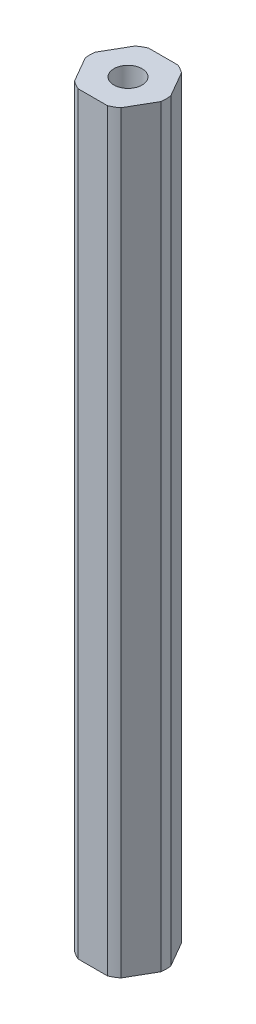
ISO-10303-21;
HEADER;
FILE_DESCRIPTION(('STEP AP214'),'2;1');
FILE_NAME('part.step','',(''),(''),'','','');
FILE_SCHEMA(('AUTOMOTIVE_DESIGN { 1 0 10303 214 1 1 1 1 }'));
ENDSEC;
DATA;
#1=APPLICATION_CONTEXT('core data for automotive mechanical design processes');
#2=APPLICATION_PROTOCOL_DEFINITION('international standard','automotive_design',2000,#1);
#3=PRODUCT_CONTEXT('',#1,'mechanical');
#4=PRODUCT('Part','Part','',(#3));
#5=PRODUCT_RELATED_PRODUCT_CATEGORY('part','',(#4));
#6=PRODUCT_DEFINITION_FORMATION('','',#4);
#7=PRODUCT_DEFINITION_CONTEXT('part definition',#1,'design');
#8=PRODUCT_DEFINITION('design','',#6,#7);
#9=PRODUCT_DEFINITION_SHAPE('','',#8);
#10=(LENGTH_UNIT() NAMED_UNIT(*) SI_UNIT(.MILLI.,.METRE.));
#11=(NAMED_UNIT(*) PLANE_ANGLE_UNIT() SI_UNIT($,.RADIAN.));
#12=(NAMED_UNIT(*) SI_UNIT($,.STERADIAN.) SOLID_ANGLE_UNIT());
#13=UNCERTAINTY_MEASURE_WITH_UNIT(LENGTH_MEASURE(1.E-05),#10,'distance_accuracy_value','');
#14=(GEOMETRIC_REPRESENTATION_CONTEXT(3) GLOBAL_UNCERTAINTY_ASSIGNED_CONTEXT((#13)) GLOBAL_UNIT_ASSIGNED_CONTEXT((#10,
#11,#12)) REPRESENTATION_CONTEXT('',''));
#15=CARTESIAN_POINT('',(0.,0.,0.));
#16=DIRECTION('',(0.,0.,1.));
#17=DIRECTION('',(1.,0.,0.));
#18=AXIS2_PLACEMENT_3D('',#15,#16,#17);
#19=CARTESIAN_POINT('',(0.,67.945,6.35));
#20=DIRECTION('',(0.,0.,-1.));
#21=DIRECTION('',(-1.,0.,0.));
#22=AXIS2_PLACEMENT_3D('',#19,#20,#21);
#23=PLANE('',#22);
#24=DIRECTION('',(1.,0.,0.));
#25=VECTOR('',#24,1.);
#26=CARTESIAN_POINT('',(0.,-67.945,6.35));
#27=LINE('',#26,#25);
#28=CARTESIAN_POINT('',(-2.63701547367474,-67.945,6.35));
#29=VERTEX_POINT('',#28);
#30=CARTESIAN_POINT('',(2.63701547367474,-67.945,6.35));
#31=VERTEX_POINT('',#30);
#32=EDGE_CURVE('E161',#29,#31,#27,.T.);
#33=ORIENTED_EDGE('',*,*,#32,.T.);
#34=DIRECTION('',(0.,-1.,0.));
#35=VECTOR('',#34,1.);
#36=CARTESIAN_POINT('',(2.63701547367474,67.945,6.35));
#37=LINE('',#36,#35);
#38=CARTESIAN_POINT('',(2.63701547367474,67.945,6.35));
#39=VERTEX_POINT('',#38);
#40=EDGE_CURVE('E11',#39,#31,#37,.T.);
#41=ORIENTED_EDGE('',*,*,#40,.F.);
#42=DIRECTION('',(1.,0.,0.));
#43=VECTOR('',#42,1.);
#44=CARTESIAN_POINT('',(0.,67.945,6.35));
#45=LINE('',#44,#43);
#46=CARTESIAN_POINT('',(-2.63701547367474,67.945,6.35));
#47=VERTEX_POINT('',#46);
#48=EDGE_CURVE('E220',#47,#39,#45,.T.);
#49=ORIENTED_EDGE('',*,*,#48,.F.);
#50=DIRECTION('',(0.,-1.,0.));
#51=VECTOR('',#50,1.);
#52=CARTESIAN_POINT('',(-2.63701547367474,67.945,6.35));
#53=LINE('',#52,#51);
#54=EDGE_CURVE('E154',#47,#29,#53,.T.);
#55=ORIENTED_EDGE('',*,*,#54,.T.);
#56=EDGE_LOOP('',(#33,#41,#49,#55));
#57=FACE_BOUND('',#56,.T.);
#58=ADVANCED_FACE('F36',(#57),#23,.F.);
#59=CARTESIAN_POINT('',(0.,67.945,0.));
#60=DIRECTION('',(0.,-1.,0.));
#61=DIRECTION('',(0.,0.,-1.));
#62=AXIS2_PLACEMENT_3D('',#59,#60,#61);
#63=CYLINDRICAL_SURFACE('',#62,6.87578);
#64=CARTESIAN_POINT('',(0.,-67.945,0.));
#65=DIRECTION('',(0.,1.,0.));
#66=DIRECTION('',(0.,0.,1.));
#67=AXIS2_PLACEMENT_3D('',#64,#65,#66);
#68=CIRCLE('',#67,6.87578);
#69=CARTESIAN_POINT('',(4.18075357719382,-67.945,5.45872239037497));
#70=VERTEX_POINT('',#69);
#71=EDGE_CURVE('E164',#31,#70,#68,.T.);
#72=ORIENTED_EDGE('',*,*,#71,.T.);
#73=DIRECTION('',(0.,-1.,0.));
#74=VECTOR('',#73,1.);
#75=CARTESIAN_POINT('',(4.18075357719382,67.945,5.45872239037497));
#76=LINE('',#75,#74);
#77=CARTESIAN_POINT('',(4.18075357719382,67.945,5.45872239037497));
#78=VERTEX_POINT('',#77);
#79=EDGE_CURVE('E45',#78,#70,#76,.T.);
#80=ORIENTED_EDGE('',*,*,#79,.F.);
#81=CARTESIAN_POINT('',(0.,67.945,0.));
#82=DIRECTION('',(0.,1.,0.));
#83=DIRECTION('',(0.,0.,1.));
#84=AXIS2_PLACEMENT_3D('',#81,#82,#83);
#85=CIRCLE('',#84,6.87578);
#86=EDGE_CURVE('E108',#39,#78,#85,.T.);
#87=ORIENTED_EDGE('',*,*,#86,.F.);
#88=ORIENTED_EDGE('',*,*,#40,.T.);
#89=EDGE_LOOP('',(#72,#80,#87,#88));
#90=FACE_BOUND('',#89,.T.);
#91=ADVANCED_FACE('F255',(#90),#63,.T.);
#92=CARTESIAN_POINT('',(5.49926131403119,67.945,3.175));
#93=DIRECTION('',(-0.866025403784439,0.,-0.5));
#94=DIRECTION('',(-0.5,0.,0.866025403784439));
#95=AXIS2_PLACEMENT_3D('',#92,#93,#94);
#96=PLANE('',#95);
#97=DIRECTION('',(0.5,0.,-0.866025403784439));
#98=VECTOR('',#97,1.);
#99=CARTESIAN_POINT('',(5.49926131403119,-67.945,3.175));
#100=LINE('',#99,#98);
#101=CARTESIAN_POINT('',(6.81776905086855,-67.945,0.891277609625022));
#102=VERTEX_POINT('',#101);
#103=EDGE_CURVE('E166',#70,#102,#100,.T.);
#104=ORIENTED_EDGE('',*,*,#103,.T.);
#105=DIRECTION('',(0.,-1.,0.));
#106=VECTOR('',#105,1.);
#107=CARTESIAN_POINT('',(6.81776905086855,67.945,0.891277609625022));
#108=LINE('',#107,#106);
#109=CARTESIAN_POINT('',(6.81776905086855,67.945,0.891277609625022));
#110=VERTEX_POINT('',#109);
#111=EDGE_CURVE('E196',#110,#102,#108,.T.);
#112=ORIENTED_EDGE('',*,*,#111,.F.);
#113=DIRECTION('',(0.5,0.,-0.866025403784439));
#114=VECTOR('',#113,1.);
#115=CARTESIAN_POINT('',(5.49926131403119,67.945,3.175));
#116=LINE('',#115,#114);
#117=EDGE_CURVE('E204',#78,#110,#116,.T.);
#118=ORIENTED_EDGE('',*,*,#117,.F.);
#119=ORIENTED_EDGE('',*,*,#79,.T.);
#120=EDGE_LOOP('',(#104,#112,#118,#119));
#121=FACE_BOUND('',#120,.T.);
#122=ADVANCED_FACE('F202',(#121),#96,.F.);
#123=CARTESIAN_POINT('',(6.81776905086856,-67.945,-0.891277609625022));
#124=VERTEX_POINT('',#123);
#125=EDGE_CURVE('E167',#102,#124,#68,.T.);
#126=ORIENTED_EDGE('',*,*,#125,.T.);
#127=DIRECTION('',(0.,-1.,0.));
#128=VECTOR('',#127,1.);
#129=CARTESIAN_POINT('',(6.81776905086856,67.945,-0.891277609625022));
#130=LINE('',#129,#128);
#131=CARTESIAN_POINT('',(6.81776905086856,67.945,-0.891277609625022));
#132=VERTEX_POINT('',#131);
#133=EDGE_CURVE('E193',#132,#124,#130,.T.);
#134=ORIENTED_EDGE('',*,*,#133,.F.);
#135=EDGE_CURVE('E226',#110,#132,#85,.T.);
#136=ORIENTED_EDGE('',*,*,#135,.F.);
#137=ORIENTED_EDGE('',*,*,#111,.T.);
#138=EDGE_LOOP('',(#126,#134,#136,#137));
#139=FACE_BOUND('',#138,.T.);
#140=ADVANCED_FACE('F237',(#139),#63,.T.);
#141=CARTESIAN_POINT('',(5.49926131403118,67.945,-3.175));
#142=DIRECTION('',(-0.866025403784438,0.,0.5));
#143=DIRECTION('',(0.5,0.,0.866025403784439));
#144=AXIS2_PLACEMENT_3D('',#141,#142,#143);
#145=PLANE('',#144);
#146=DIRECTION('',(-0.5,0.,-0.866025403784439));
#147=VECTOR('',#146,1.);
#148=CARTESIAN_POINT('',(5.49926131403118,-67.945,-3.175));
#149=LINE('',#148,#147);
#150=CARTESIAN_POINT('',(4.18075357719381,-67.945,-5.45872239037498));
#151=VERTEX_POINT('',#150);
#152=EDGE_CURVE('E169',#124,#151,#149,.T.);
#153=ORIENTED_EDGE('',*,*,#152,.T.);
#154=DIRECTION('',(0.,-1.,0.));
#155=VECTOR('',#154,1.);
#156=CARTESIAN_POINT('',(4.18075357719381,67.945,-5.45872239037498));
#157=LINE('',#156,#155);
#158=CARTESIAN_POINT('',(4.18075357719381,67.945,-5.45872239037498));
#159=VERTEX_POINT('',#158);
#160=EDGE_CURVE('E190',#159,#151,#157,.T.);
#161=ORIENTED_EDGE('',*,*,#160,.F.);
#162=DIRECTION('',(-0.5,0.,-0.866025403784439));
#163=VECTOR('',#162,1.);
#164=CARTESIAN_POINT('',(5.49926131403118,67.945,-3.175));
#165=LINE('',#164,#163);
#166=EDGE_CURVE('E228',#132,#159,#165,.T.);
#167=ORIENTED_EDGE('',*,*,#166,.F.);
#168=ORIENTED_EDGE('',*,*,#133,.T.);
#169=EDGE_LOOP('',(#153,#161,#167,#168));
#170=FACE_BOUND('',#169,.T.);
#171=ADVANCED_FACE('F239',(#170),#145,.F.);
#172=CARTESIAN_POINT('',(2.63701547367473,-67.945,-6.35));
#173=VERTEX_POINT('',#172);
#174=EDGE_CURVE('E171',#151,#173,#68,.T.);
#175=ORIENTED_EDGE('',*,*,#174,.T.);
#176=DIRECTION('',(0.,-1.,0.));
#177=VECTOR('',#176,1.);
#178=CARTESIAN_POINT('',(2.63701547367473,67.945,-6.35));
#179=LINE('',#178,#177);
#180=CARTESIAN_POINT('',(2.63701547367473,67.945,-6.35));
#181=VERTEX_POINT('',#180);
#182=EDGE_CURVE('E187',#181,#173,#179,.T.);
#183=ORIENTED_EDGE('',*,*,#182,.F.);
#184=EDGE_CURVE('E229',#159,#181,#85,.T.);
#185=ORIENTED_EDGE('',*,*,#184,.F.);
#186=ORIENTED_EDGE('',*,*,#160,.T.);
#187=EDGE_LOOP('',(#175,#183,#185,#186));
#188=FACE_BOUND('',#187,.T.);
#189=ADVANCED_FACE('F240',(#188),#63,.T.);
#190=CARTESIAN_POINT('',(0.,67.945,-6.35));
#191=DIRECTION('',(0.,0.,1.));
#192=DIRECTION('',(1.,0.,0.));
#193=AXIS2_PLACEMENT_3D('',#190,#191,#192);
#194=PLANE('',#193);
#195=DIRECTION('',(-1.,0.,0.));
#196=VECTOR('',#195,1.);
#197=CARTESIAN_POINT('',(0.,-67.945,-6.35));
#198=LINE('',#197,#196);
#199=CARTESIAN_POINT('',(-2.63701547367473,-67.945,-6.35));
#200=VERTEX_POINT('',#199);
#201=EDGE_CURVE('E172',#173,#200,#198,.T.);
#202=ORIENTED_EDGE('',*,*,#201,.T.);
#203=DIRECTION('',(0.,-1.,0.));
#204=VECTOR('',#203,1.);
#205=CARTESIAN_POINT('',(-2.63701547367473,67.945,-6.35));
#206=LINE('',#205,#204);
#207=CARTESIAN_POINT('',(-2.63701547367473,67.945,-6.35));
#208=VERTEX_POINT('',#207);
#209=EDGE_CURVE('E184',#208,#200,#206,.T.);
#210=ORIENTED_EDGE('',*,*,#209,.F.);
#211=DIRECTION('',(-1.,0.,0.));
#212=VECTOR('',#211,1.);
#213=CARTESIAN_POINT('',(0.,67.945,-6.35));
#214=LINE('',#213,#212);
#215=EDGE_CURVE('E230',#181,#208,#214,.T.);
#216=ORIENTED_EDGE('',*,*,#215,.F.);
#217=ORIENTED_EDGE('',*,*,#182,.T.);
#218=EDGE_LOOP('',(#202,#210,#216,#217));
#219=FACE_BOUND('',#218,.T.);
#220=ADVANCED_FACE('F243',(#219),#194,.F.);
#221=CARTESIAN_POINT('',(-4.18075357719382,-67.945,-5.45872239037497));
#222=VERTEX_POINT('',#221);
#223=EDGE_CURVE('E174',#200,#222,#68,.T.);
#224=ORIENTED_EDGE('',*,*,#223,.T.);
#225=DIRECTION('',(0.,-1.,0.));
#226=VECTOR('',#225,1.);
#227=CARTESIAN_POINT('',(-4.18075357719382,67.945,-5.45872239037497));
#228=LINE('',#227,#226);
#229=CARTESIAN_POINT('',(-4.18075357719382,67.945,-5.45872239037497));
#230=VERTEX_POINT('',#229);
#231=EDGE_CURVE('E181',#230,#222,#228,.T.);
#232=ORIENTED_EDGE('',*,*,#231,.F.);
#233=EDGE_CURVE('E144',#208,#230,#85,.T.);
#234=ORIENTED_EDGE('',*,*,#233,.F.);
#235=ORIENTED_EDGE('',*,*,#209,.T.);
#236=EDGE_LOOP('',(#224,#232,#234,#235));
#237=FACE_BOUND('',#236,.T.);
#238=ADVANCED_FACE('F245',(#237),#63,.T.);
#239=CARTESIAN_POINT('',(-5.49926131403119,67.945,-3.175));
#240=DIRECTION('',(0.866025403784438,0.,0.5));
#241=DIRECTION('',(0.5,0.,-0.866025403784439));
#242=AXIS2_PLACEMENT_3D('',#239,#240,#241);
#243=PLANE('',#242);
#244=DIRECTION('',(-0.5,0.,0.866025403784439));
#245=VECTOR('',#244,1.);
#246=CARTESIAN_POINT('',(-5.49926131403119,-67.945,-3.175));
#247=LINE('',#246,#245);
#248=CARTESIAN_POINT('',(-6.81776905086855,-67.945,-0.891277609625031));
#249=VERTEX_POINT('',#248);
#250=EDGE_CURVE('E175',#222,#249,#247,.T.);
#251=ORIENTED_EDGE('',*,*,#250,.T.);
#252=DIRECTION('',(0.,-1.,0.));
#253=VECTOR('',#252,1.);
#254=CARTESIAN_POINT('',(-6.81776905086855,67.945,-0.891277609625031));
#255=LINE('',#254,#253);
#256=CARTESIAN_POINT('',(-6.81776905086855,67.945,-0.891277609625031));
#257=VERTEX_POINT('',#256);
#258=EDGE_CURVE('E149',#257,#249,#255,.T.);
#259=ORIENTED_EDGE('',*,*,#258,.F.);
#260=DIRECTION('',(-0.5,0.,0.866025403784439));
#261=VECTOR('',#260,1.);
#262=CARTESIAN_POINT('',(-5.49926131403119,67.945,-3.175));
#263=LINE('',#262,#261);
#264=EDGE_CURVE('E139',#230,#257,#263,.T.);
#265=ORIENTED_EDGE('',*,*,#264,.F.);
#266=ORIENTED_EDGE('',*,*,#231,.T.);
#267=EDGE_LOOP('',(#251,#259,#265,#266));
#268=FACE_BOUND('',#267,.T.);
#269=ADVANCED_FACE('F248',(#268),#243,.F.);
#270=CARTESIAN_POINT('',(-6.81776905086855,-67.945,0.891277609625025));
#271=VERTEX_POINT('',#270);
#272=EDGE_CURVE('E148',#249,#271,#68,.T.);
#273=ORIENTED_EDGE('',*,*,#272,.T.);
#274=DIRECTION('',(0.,-1.,0.));
#275=VECTOR('',#274,1.);
#276=CARTESIAN_POINT('',(-6.81776905086855,67.945,0.891277609625025));
#277=LINE('',#276,#275);
#278=CARTESIAN_POINT('',(-6.81776905086855,67.945,0.891277609625025));
#279=VERTEX_POINT('',#278);
#280=EDGE_CURVE('E145',#279,#271,#277,.T.);
#281=ORIENTED_EDGE('',*,*,#280,.F.);
#282=EDGE_CURVE('E133',#257,#279,#85,.T.);
#283=ORIENTED_EDGE('',*,*,#282,.F.);
#284=ORIENTED_EDGE('',*,*,#258,.T.);
#285=EDGE_LOOP('',(#273,#281,#283,#284));
#286=FACE_BOUND('',#285,.T.);
#287=ADVANCED_FACE('F146',(#286),#63,.T.);
#288=CARTESIAN_POINT('',(-5.49926131403118,67.945,3.175));
#289=DIRECTION('',(0.866025403784438,0.,-0.5));
#290=DIRECTION('',(-0.5,0.,-0.866025403784438));
#291=AXIS2_PLACEMENT_3D('',#288,#289,#290);
#292=PLANE('',#291);
#293=DIRECTION('',(0.5,0.,0.866025403784438));
#294=VECTOR('',#293,1.);
#295=CARTESIAN_POINT('',(-5.49926131403118,-67.945,3.175));
#296=LINE('',#295,#294);
#297=CARTESIAN_POINT('',(-4.18075357719381,-67.945,5.45872239037498));
#298=VERTEX_POINT('',#297);
#299=EDGE_CURVE('E94',#271,#298,#296,.T.);
#300=ORIENTED_EDGE('',*,*,#299,.T.);
#301=DIRECTION('',(0.,-1.,0.));
#302=VECTOR('',#301,1.);
#303=CARTESIAN_POINT('',(-4.18075357719381,67.945,5.45872239037498));
#304=LINE('',#303,#302);
#305=CARTESIAN_POINT('',(-4.18075357719381,67.945,5.45872239037498));
#306=VERTEX_POINT('',#305);
#307=EDGE_CURVE('E150',#306,#298,#304,.T.);
#308=ORIENTED_EDGE('',*,*,#307,.F.);
#309=DIRECTION('',(0.5,0.,0.866025403784438));
#310=VECTOR('',#309,1.);
#311=CARTESIAN_POINT('',(-5.49926131403118,67.945,3.175));
#312=LINE('',#311,#310);
#313=EDGE_CURVE('E137',#279,#306,#312,.T.);
#314=ORIENTED_EDGE('',*,*,#313,.F.);
#315=ORIENTED_EDGE('',*,*,#280,.T.);
#316=EDGE_LOOP('',(#300,#308,#314,#315));
#317=FACE_BOUND('',#316,.T.);
#318=ADVANCED_FACE('F152',(#317),#292,.F.);
#319=CARTESIAN_POINT('',(0.,67.945,0.));
#320=DIRECTION('',(0.,-1.,0.));
#321=DIRECTION('',(0.,0.,-1.));
#322=AXIS2_PLACEMENT_3D('',#319,#320,#321);
#323=CYLINDRICAL_SURFACE('',#322,2.5527);
#324=CARTESIAN_POINT('',(0.,67.945,0.));
#325=DIRECTION('',(0.,1.,0.));
#326=DIRECTION('',(0.,0.,1.));
#327=AXIS2_PLACEMENT_3D('',#324,#325,#326);
#328=CIRCLE('',#327,2.5527);
#329=CARTESIAN_POINT('',(0.,67.945,2.5527));
#330=VERTEX_POINT('',#329);
#331=EDGE_CURVE('E218',#330,#330,#328,.T.);
#332=ORIENTED_EDGE('',*,*,#331,.T.);
#333=EDGE_LOOP('',(#332));
#334=FACE_BOUND('',#333,.T.);
#335=CARTESIAN_POINT('',(0.,-67.945,0.));
#336=DIRECTION('',(0.,1.,0.));
#337=DIRECTION('',(0.,0.,1.));
#338=AXIS2_PLACEMENT_3D('',#335,#336,#337);
#339=CIRCLE('',#338,2.5527);
#340=CARTESIAN_POINT('',(0.,-67.945,2.5527));
#341=VERTEX_POINT('',#340);
#342=EDGE_CURVE('E158',#341,#341,#339,.T.);
#343=ORIENTED_EDGE('',*,*,#342,.F.);
#344=EDGE_LOOP('',(#343));
#345=FACE_BOUND('',#344,.T.);
#346=ADVANCED_FACE('F38',(#334,#345),#323,.F.);
#347=EDGE_CURVE('E100',#298,#29,#68,.T.);
#348=ORIENTED_EDGE('',*,*,#347,.T.);
#349=ORIENTED_EDGE('',*,*,#54,.F.);
#350=EDGE_CURVE('E53',#306,#47,#85,.T.);
#351=ORIENTED_EDGE('',*,*,#350,.F.);
#352=ORIENTED_EDGE('',*,*,#307,.T.);
#353=EDGE_LOOP('',(#348,#349,#351,#352));
#354=FACE_BOUND('',#353,.T.);
#355=ADVANCED_FACE('F252',(#354),#63,.T.);
#356=CARTESIAN_POINT('',(0.,67.945,0.));
#357=DIRECTION('',(0.,1.,0.));
#358=DIRECTION('',(0.,0.,1.));
#359=AXIS2_PLACEMENT_3D('',#356,#357,#358);
#360=PLANE('',#359);
#361=ORIENTED_EDGE('',*,*,#331,.F.);
#362=EDGE_LOOP('',(#361));
#363=FACE_BOUND('',#362,.T.);
#364=ORIENTED_EDGE('',*,*,#48,.T.);
#365=ORIENTED_EDGE('',*,*,#86,.T.);
#366=ORIENTED_EDGE('',*,*,#117,.T.);
#367=ORIENTED_EDGE('',*,*,#135,.T.);
#368=ORIENTED_EDGE('',*,*,#166,.T.);
#369=ORIENTED_EDGE('',*,*,#184,.T.);
#370=ORIENTED_EDGE('',*,*,#215,.T.);
#371=ORIENTED_EDGE('',*,*,#233,.T.);
#372=ORIENTED_EDGE('',*,*,#264,.T.);
#373=ORIENTED_EDGE('',*,*,#282,.T.);
#374=ORIENTED_EDGE('',*,*,#313,.T.);
#375=ORIENTED_EDGE('',*,*,#350,.T.);
#376=EDGE_LOOP('',(#364,#365,#366,#367,#368,#369,#370,#371,#372,#373,#374,#375));
#377=FACE_BOUND('',#376,.T.);
#378=ADVANCED_FACE('F135',(#363,#377),#360,.T.);
#379=CARTESIAN_POINT('',(0.,-67.945,0.));
#380=DIRECTION('',(0.,1.,0.));
#381=DIRECTION('',(0.,0.,1.));
#382=AXIS2_PLACEMENT_3D('',#379,#380,#381);
#383=PLANE('',#382);
#384=ORIENTED_EDGE('',*,*,#342,.T.);
#385=EDGE_LOOP('',(#384));
#386=FACE_BOUND('',#385,.T.);
#387=ORIENTED_EDGE('',*,*,#32,.F.);
#388=ORIENTED_EDGE('',*,*,#347,.F.);
#389=ORIENTED_EDGE('',*,*,#299,.F.);
#390=ORIENTED_EDGE('',*,*,#272,.F.);
#391=ORIENTED_EDGE('',*,*,#250,.F.);
#392=ORIENTED_EDGE('',*,*,#223,.F.);
#393=ORIENTED_EDGE('',*,*,#201,.F.);
#394=ORIENTED_EDGE('',*,*,#174,.F.);
#395=ORIENTED_EDGE('',*,*,#152,.F.);
#396=ORIENTED_EDGE('',*,*,#125,.F.);
#397=ORIENTED_EDGE('',*,*,#103,.F.);
#398=ORIENTED_EDGE('',*,*,#71,.F.);
#399=EDGE_LOOP('',(#387,#388,#389,#390,#391,#392,#393,#394,#395,#396,#397,#398));
#400=FACE_BOUND('',#399,.T.);
#401=ADVANCED_FACE('F208',(#386,#400),#383,.F.);
#402=CLOSED_SHELL('',(#58,#91,#122,#140,#171,#189,#220,#238,#269,#287,#318,#346,#355,#378,#401));
#403=MANIFOLD_SOLID_BREP('B2',#402);
#404=ADVANCED_BREP_SHAPE_REPRESENTATION('',(#18,#403),#14);
#405=SHAPE_DEFINITION_REPRESENTATION(#9,#404);
ENDSEC;
END-ISO-10303-21;
